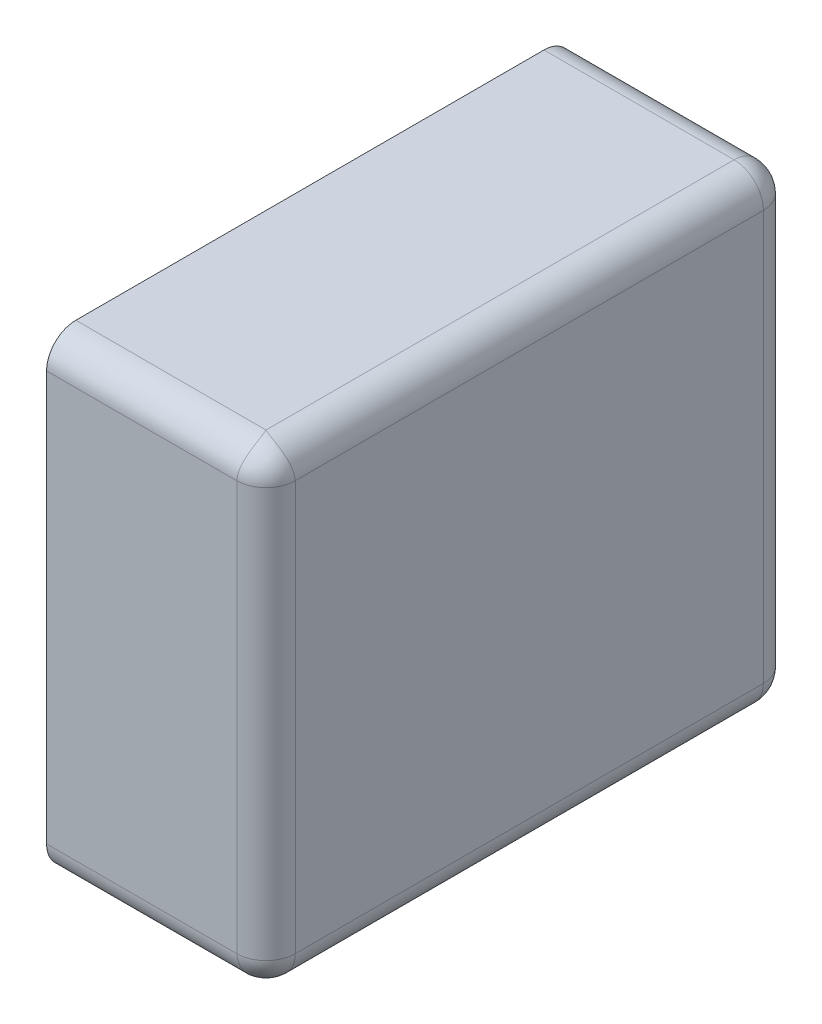
ISO-10303-21;
HEADER;
FILE_DESCRIPTION(('STEP AP214'),'2;1');
FILE_NAME('part.step','',(''),(''),'','','');
FILE_SCHEMA(('AUTOMOTIVE_DESIGN { 1 0 10303 214 1 1 1 1 }'));
ENDSEC;
DATA;
#1=APPLICATION_CONTEXT('core data for automotive mechanical design processes');
#2=APPLICATION_PROTOCOL_DEFINITION('international standard','automotive_design',2000,#1);
#3=PRODUCT_CONTEXT('',#1,'mechanical');
#4=PRODUCT('Part','Part','',(#3));
#5=PRODUCT_RELATED_PRODUCT_CATEGORY('part','',(#4));
#6=PRODUCT_DEFINITION_FORMATION('','',#4);
#7=PRODUCT_DEFINITION_CONTEXT('part definition',#1,'design');
#8=PRODUCT_DEFINITION('design','',#6,#7);
#9=PRODUCT_DEFINITION_SHAPE('','',#8);
#10=(LENGTH_UNIT() NAMED_UNIT(*) SI_UNIT(.MILLI.,.METRE.));
#11=(NAMED_UNIT(*) PLANE_ANGLE_UNIT() SI_UNIT($,.RADIAN.));
#12=(NAMED_UNIT(*) SI_UNIT($,.STERADIAN.) SOLID_ANGLE_UNIT());
#13=UNCERTAINTY_MEASURE_WITH_UNIT(LENGTH_MEASURE(1.E-05),#10,'distance_accuracy_value','');
#14=(GEOMETRIC_REPRESENTATION_CONTEXT(3) GLOBAL_UNCERTAINTY_ASSIGNED_CONTEXT((#13)) GLOBAL_UNIT_ASSIGNED_CONTEXT((#10,
#11,#12)) REPRESENTATION_CONTEXT('',''));
#15=CARTESIAN_POINT('',(0.,0.,0.));
#16=DIRECTION('',(0.,0.,1.));
#17=DIRECTION('',(1.,0.,0.));
#18=AXIS2_PLACEMENT_3D('',#15,#16,#17);
#19=CARTESIAN_POINT('',(0.75,-0.35,0.85));
#20=DIRECTION('',(-0.408248290463863,-0.816496580927726,-0.408248290463863));
#21=DIRECTION('',(0.577350269189626,-0.577350269189626,0.577350269189626));
#22=AXIS2_PLACEMENT_3D('',#19,#20,#21);
#23=SPHERICAL_SURFACE('',#22,0.05);
#24=CARTESIAN_POINT('',(0.75,-0.35,0.9));
#25=CARTESIAN_POINT('',(0.750056476640882,-0.350831352427667,0.900000020313967));
#26=CARTESIAN_POINT('',(0.750121168311557,-0.351662111124828,0.899979171317549));
#27=CARTESIAN_POINT('',(0.750265391195623,-0.353324024248752,0.899895695565037));
#28=CARTESIAN_POINT('',(0.750344988001439,-0.354155163571538,0.899832880868058));
#29=CARTESIAN_POINT('',(0.750517234671643,-0.355815236106077,0.899665097579262));
#30=CARTESIAN_POINT('',(0.750609936033336,-0.356644146794953,0.899559959502557));
#31=CARTESIAN_POINT('',(0.750806520816707,-0.358297216645363,0.899307372398355));
#32=CARTESIAN_POINT('',(0.75091044290025,-0.359121348357221,0.899159773963409));
#33=CARTESIAN_POINT('',(0.751127528752862,-0.360762347249152,0.898822292392348));
#34=CARTESIAN_POINT('',(0.751240719867609,-0.361579184426825,0.898632281058567));
#35=CARTESIAN_POINT('',(0.751474344176626,-0.363203132016743,0.898210195281024));
#36=CARTESIAN_POINT('',(0.751594795122853,-0.364010212271137,0.897978014684369));
#37=CARTESIAN_POINT('',(0.751840892195576,-0.365612241167447,0.897472005262752));
#38=CARTESIAN_POINT('',(0.751966548375925,-0.36640716184318,0.897198092814035));
#39=CARTESIAN_POINT('',(0.752220973549075,-0.367982533533888,0.896609228401466));
#40=CARTESIAN_POINT('',(0.752349746928956,-0.36876296105217,0.89629421548598));
#41=CARTESIAN_POINT('',(0.752608300810853,-0.370307083417801,0.89562395131688));
#42=CARTESIAN_POINT('',(0.752738082163723,-0.371070761417873,0.895268661584212));
#43=CARTESIAN_POINT('',(0.752996535248399,-0.372579204861783,0.894518835357465));
#44=CARTESIAN_POINT('',(0.753125206487437,-0.373323962166104,0.894124282319878));
#45=CARTESIAN_POINT('',(0.753379323912972,-0.374792475072041,0.893297108379355));
#46=CARTESIAN_POINT('',(0.753504770480528,-0.37551623315645,0.892864492001337));
#47=CARTESIAN_POINT('',(0.753750336828149,-0.376940756399464,0.891962553597264));
#48=CARTESIAN_POINT('',(0.753870460068205,-0.377641536413672,0.891493255977843));
#49=CARTESIAN_POINT('',(0.754103304064891,-0.379018216920503,0.890519495705679));
#50=CARTESIAN_POINT('',(0.754216033516177,-0.379694146209385,0.890015075848481));
#51=CARTESIAN_POINT('',(0.754432052512975,-0.381019349498018,0.888972784289588));
#52=CARTESIAN_POINT('',(0.754535358057478,-0.381668667602786,0.888434971990044));
#53=CARTESIAN_POINT('',(0.754730542154479,-0.382938989255036,0.887327774609329));
#54=CARTESIAN_POINT('',(0.754822445957708,-0.383560053368979,0.886758463484926));
#55=CARTESIAN_POINT('',(0.754992901649071,-0.384772329390201,0.885590305843476));
#56=CARTESIAN_POINT('',(0.755071489829275,-0.3853636192483,0.88499154553938));
#57=CARTESIAN_POINT('',(0.755213463043959,-0.386514935275151,0.883766676890247));
#58=CARTESIAN_POINT('',(0.755276897009026,-0.387075057459189,0.883140664496341));
#59=CARTESIAN_POINT('',(0.755386795425954,-0.388162756781776,0.881863619839021));
#60=CARTESIAN_POINT('',(0.755433322818258,-0.388690448425676,0.881212690558093));
#61=CARTESIAN_POINT('',(0.755507737338679,-0.389712138796154,0.879888271236327));
#62=CARTESIAN_POINT('',(0.75553570253075,-0.390206270678963,0.879214888348585));
#63=CARTESIAN_POINT('',(0.755571427793508,-0.391159829885339,0.877848141278855));
#64=CARTESIAN_POINT('',(0.755579281877824,-0.391619408903357,0.877154885445235));
#65=CARTESIAN_POINT('',(0.755573335713261,-0.392502989090476,0.875751081087255));
#66=CARTESIAN_POINT('',(0.755559645939104,-0.392927160099263,0.875040639060477));
#67=CARTESIAN_POINT('',(0.755509287643763,-0.393739190835606,0.873605248184243));
#68=CARTESIAN_POINT('',(0.755472746231199,-0.394127237870004,0.872880400913832));
#69=CARTESIAN_POINT('',(0.755375493621831,-0.394866427926017,0.871419070457526));
#70=CARTESIAN_POINT('',(0.755314925981526,-0.395217774756478,0.870682680895238));
#71=CARTESIAN_POINT('',(0.755168570932992,-0.395883112710797,0.869201208347948));
#72=CARTESIAN_POINT('',(0.755082942970717,-0.396197322893436,0.868456208087868));
#73=CARTESIAN_POINT('',(0.754885566112575,-0.396788076154931,0.866960517038454));
#74=CARTESIAN_POINT('',(0.754773991607376,-0.397064852010877,0.866209895271862));
#75=CARTESIAN_POINT('',(0.754523973299393,-0.397580565826942,0.864706002926951));
#76=CARTESIAN_POINT('',(0.754385717519098,-0.39781974846915,0.863952785138196));
#77=CARTESIAN_POINT('',(0.754081755398417,-0.398260239191747,0.862446796385434));
#78=CARTESIAN_POINT('',(0.753916248962334,-0.398461801820209,0.861694059537444));
#79=CARTESIAN_POINT('',(0.75355734372636,-0.398827165694317,0.860192060427522));
#80=CARTESIAN_POINT('',(0.753364154831346,-0.398991228948502,0.859442812292273));
#81=CARTESIAN_POINT('',(0.753052732369609,-0.39920955873537,0.858321945507501));
#82=CARTESIAN_POINT('',(0.752945638881777,-0.399277560154943,0.857949832604319));
#83=CARTESIAN_POINT('',(0.752724431166697,-0.3994042588909,0.857207637428366));
#84=CARTESIAN_POINT('',(0.752610344441124,-0.399462989767779,0.856837552741953));
#85=CARTESIAN_POINT('',(0.752375149481327,-0.399571193360768,0.856099812695661));
#86=CARTESIAN_POINT('',(0.752254068989278,-0.399620699753114,0.855732153421865));
#87=CARTESIAN_POINT('',(0.752004892004011,-0.399710512986096,0.854999641822439));
#88=CARTESIAN_POINT('',(0.751876823418455,-0.399750853511815,0.854634784141683));
#89=CARTESIAN_POINT('',(0.75161368768569,-0.399822399896224,0.853908256305697));
#90=CARTESIAN_POINT('',(0.751478648512781,-0.399853639363523,0.853546579332125));
#91=CARTESIAN_POINT('',(0.751201599789781,-0.399907056499251,0.85282678964261));
#92=CARTESIAN_POINT('',(0.751059618183824,-0.39992926760641,0.852468668656838));
#93=CARTESIAN_POINT('',(0.750768722771826,-0.39996470752091,0.851756364451594));
#94=CARTESIAN_POINT('',(0.750619836783965,-0.399977969507428,0.851402171529021));
#95=CARTESIAN_POINT('',(0.750315184973883,-0.399995600075518,0.850698095332166));
#96=CARTESIAN_POINT('',(0.75015944673132,-0.400000001475902,0.850348200942932));
#97=CARTESIAN_POINT('',(0.75,-0.4,0.85));
#98=B_SPLINE_CURVE_WITH_KNOTS('',3,(#24,#25,#26,#27,#28,#29,#30,#31,#32,#33,#34,#35,#36,#37,#38,
#39,#40,#41,#42,#43,#44,#45,#46,#47,#48,#49,#50,#51,#52,#53,#54,#55,#56,#57,#58,#59,#60,#61,#62,
#63,#64,#65,#66,#67,#68,#69,#70,#71,#72,#73,#74,#75,#76,#77,#78,#79,#80,#81,#82,#83,#84,#85,#86,
#87,#88,#89,#90,#91,#92,#93,#94,#95,#96,#97),.UNSPECIFIED.,.F.,.F.,(4,2,2,2,2,2,2,2,2,2,2,2,2,2,
2,2,2,2,2,2,2,2,2,2,2,2,2,2,2,2,2,2,2,2,2,2,4),(0.,0.00249945349828853,0.00501017636236168,
0.00753105510997412,0.0100609150362242,0.0125985278601288,0.015142619470862,0.017691877752768,
0.020244960471291,0.0228005032044076,0.025357127306039,0.0279134478892867,0.0304680818182009,
0.0330196556971653,0.0355668138468767,0.0381082262553104,0.0406425964909795,0.0431686695642027,
0.0456852397199664,0.048191158143267,0.0506853405545278,0.0531667746687542,0.0556345274875087,
0.0580877523875283,0.0605256959638784,0.0629477045789642,0.0653532305615732,0.0677418379925142,
0.0701132080055175,0.0712924926926684,0.0724674051483095,0.0736379404537151,0.0748041017706803,
0.0759659004268234,0.077123355986903,0.078276496309334,0.0794253575870823),.UNSPECIFIED.);
#99=CARTESIAN_POINT('',(0.75,-0.35,0.9));
#100=VERTEX_POINT('',#99);
#101=CARTESIAN_POINT('',(0.75,-0.4,0.85));
#102=VERTEX_POINT('',#101);
#103=EDGE_CURVE('E11',#100,#102,#98,.T.);
#104=ORIENTED_EDGE('',*,*,#103,.T.);
#105=CARTESIAN_POINT('',(0.75,-0.35,0.85));
#106=DIRECTION('',(0.,0.,1.));
#107=DIRECTION('',(1.,0.,0.));
#108=AXIS2_PLACEMENT_3D('',#105,#106,#107);
#109=CIRCLE('',#108,0.05);
#110=CARTESIAN_POINT('',(0.8,-0.35,0.85));
#111=VERTEX_POINT('',#110);
#112=EDGE_CURVE('E25',#102,#111,#109,.T.);
#113=ORIENTED_EDGE('',*,*,#112,.T.);
#114=CARTESIAN_POINT('',(0.75,-0.35,0.85));
#115=DIRECTION('',(0.,-1.,0.));
#116=DIRECTION('',(0.,0.,1.));
#117=AXIS2_PLACEMENT_3D('',#114,#115,#116);
#118=CIRCLE('',#117,0.05);
#119=EDGE_CURVE('E272',#111,#100,#118,.T.);
#120=ORIENTED_EDGE('',*,*,#119,.T.);
#121=EDGE_LOOP('',(#104,#113,#120));
#122=FACE_BOUND('',#121,.T.);
#123=ADVANCED_FACE('F17',(#122),#23,.T.);
#124=CARTESIAN_POINT('',(0.75,-0.35,0.05));
#125=DIRECTION('',(-0.816496580927726,-0.408248290463864,-0.408248290463863));
#126=DIRECTION('',(0.577350269189626,-0.577350269189626,-0.577350269189626));
#127=AXIS2_PLACEMENT_3D('',#124,#125,#126);
#128=SPHERICAL_SURFACE('',#127,0.05);
#129=CARTESIAN_POINT('',(0.75,-0.35,0.05));
#130=DIRECTION('',(1.,0.,0.));
#131=DIRECTION('',(0.,0.,-1.));
#132=AXIS2_PLACEMENT_3D('',#129,#130,#131);
#133=CIRCLE('',#132,0.05);
#134=CARTESIAN_POINT('',(0.75,-0.4,0.05));
#135=VERTEX_POINT('',#134);
#136=CARTESIAN_POINT('',(0.75,-0.35,0.));
#137=VERTEX_POINT('',#136);
#138=EDGE_CURVE('E266',#135,#137,#133,.T.);
#139=ORIENTED_EDGE('',*,*,#138,.T.);
#140=CARTESIAN_POINT('',(0.75,-0.35,0.05));
#141=DIRECTION('',(0.,-1.,0.));
#142=DIRECTION('',(1.,0.,0.));
#143=AXIS2_PLACEMENT_3D('',#140,#141,#142);
#144=CIRCLE('',#143,0.05);
#145=CARTESIAN_POINT('',(0.8,-0.35,0.05));
#146=VERTEX_POINT('',#145);
#147=EDGE_CURVE('E268',#137,#146,#144,.T.);
#148=ORIENTED_EDGE('',*,*,#147,.T.);
#149=CARTESIAN_POINT('',(0.75,-0.35,0.05));
#150=DIRECTION('',(0.,0.,-1.));
#151=DIRECTION('',(0.,-1.,0.));
#152=AXIS2_PLACEMENT_3D('',#149,#150,#151);
#153=CIRCLE('',#152,0.05);
#154=EDGE_CURVE('E270',#146,#135,#153,.T.);
#155=ORIENTED_EDGE('',*,*,#154,.T.);
#156=EDGE_LOOP('',(#139,#148,#155));
#157=FACE_BOUND('',#156,.T.);
#158=ADVANCED_FACE('F249',(#157),#128,.T.);
#159=CARTESIAN_POINT('',(0.75,0.35,0.85));
#160=DIRECTION('',(0.408248290463863,-0.816496580927726,0.408248290463863));
#161=DIRECTION('',(0.577350269189626,0.577350269189626,0.577350269189626));
#162=AXIS2_PLACEMENT_3D('',#159,#160,#161);
#163=SPHERICAL_SURFACE('',#162,0.05);
#164=CARTESIAN_POINT('',(0.75,0.35,0.85));
#165=DIRECTION('',(0.,1.,0.));
#166=DIRECTION('',(1.,0.,0.));
#167=AXIS2_PLACEMENT_3D('',#164,#165,#166);
#168=CIRCLE('',#167,0.05);
#169=CARTESIAN_POINT('',(0.75,0.35,0.9));
#170=VERTEX_POINT('',#169);
#171=CARTESIAN_POINT('',(0.8,0.35,0.85));
#172=VERTEX_POINT('',#171);
#173=EDGE_CURVE('E300',#170,#172,#168,.T.);
#174=ORIENTED_EDGE('',*,*,#173,.T.);
#175=CARTESIAN_POINT('',(0.8,0.35,0.85));
#176=CARTESIAN_POINT('',(0.800000020313967,0.350831352427667,0.850056476640882));
#177=CARTESIAN_POINT('',(0.799979171317549,0.351662111124828,0.850121168311557));
#178=CARTESIAN_POINT('',(0.799895695565037,0.353324024248752,0.850265391195623));
#179=CARTESIAN_POINT('',(0.799832880868058,0.354155163571538,0.850344988001439));
#180=CARTESIAN_POINT('',(0.799665097579262,0.355815236106077,0.850517234671643));
#181=CARTESIAN_POINT('',(0.799559959502558,0.356644146794953,0.850609936033336));
#182=CARTESIAN_POINT('',(0.799307372398355,0.358297216645363,0.850806520816706));
#183=CARTESIAN_POINT('',(0.799159773963409,0.359121348357221,0.85091044290025));
#184=CARTESIAN_POINT('',(0.798822292392348,0.360762347249152,0.851127528752862));
#185=CARTESIAN_POINT('',(0.798632281058567,0.361579184426825,0.851240719867609));
#186=CARTESIAN_POINT('',(0.798210195281024,0.363203132016743,0.851474344176626));
#187=CARTESIAN_POINT('',(0.797978014684369,0.364010212271137,0.851594795122853));
#188=CARTESIAN_POINT('',(0.797472005262752,0.365612241167447,0.851840892195576));
#189=CARTESIAN_POINT('',(0.797198092814036,0.36640716184318,0.851966548375925));
#190=CARTESIAN_POINT('',(0.796609228401466,0.367982533533888,0.852220973549075));
#191=CARTESIAN_POINT('',(0.79629421548598,0.36876296105217,0.852349746928956));
#192=CARTESIAN_POINT('',(0.79562395131688,0.370307083417801,0.852608300810853));
#193=CARTESIAN_POINT('',(0.795268661584212,0.371070761417873,0.852738082163722));
#194=CARTESIAN_POINT('',(0.794518835357465,0.372579204861783,0.852996535248399));
#195=CARTESIAN_POINT('',(0.794124282319878,0.373323962166104,0.853125206487437));
#196=CARTESIAN_POINT('',(0.793297108379355,0.374792475072041,0.853379323912972));
#197=CARTESIAN_POINT('',(0.792864492001337,0.37551623315645,0.853504770480528));
#198=CARTESIAN_POINT('',(0.791962553597264,0.376940756399464,0.853750336828149));
#199=CARTESIAN_POINT('',(0.791493255977843,0.377641536413672,0.853870460068205));
#200=CARTESIAN_POINT('',(0.790519495705679,0.379018216920503,0.854103304064891));
#201=CARTESIAN_POINT('',(0.790015075848481,0.379694146209385,0.854216033516177));
#202=CARTESIAN_POINT('',(0.788972784289588,0.381019349498018,0.854432052512975));
#203=CARTESIAN_POINT('',(0.788434971990044,0.381668667602786,0.854535358057478));
#204=CARTESIAN_POINT('',(0.787327774609329,0.382938989255036,0.854730542154479));
#205=CARTESIAN_POINT('',(0.786758463484927,0.383560053368979,0.854822445957708));
#206=CARTESIAN_POINT('',(0.785590305843476,0.384772329390201,0.854992901649071));
#207=CARTESIAN_POINT('',(0.78499154553938,0.3853636192483,0.855071489829275));
#208=CARTESIAN_POINT('',(0.783766676890247,0.386514935275151,0.855213463043959));
#209=CARTESIAN_POINT('',(0.783140664496341,0.387075057459189,0.855276897009026));
#210=CARTESIAN_POINT('',(0.781863619839021,0.388162756781776,0.855386795425953));
#211=CARTESIAN_POINT('',(0.781212690558093,0.388690448425676,0.855433322818258));
#212=CARTESIAN_POINT('',(0.779888271236327,0.389712138796154,0.855507737338678));
#213=CARTESIAN_POINT('',(0.779214888348585,0.390206270678963,0.85553570253075));
#214=CARTESIAN_POINT('',(0.777848141278855,0.391159829885339,0.855571427793508));
#215=CARTESIAN_POINT('',(0.777154885445235,0.391619408903357,0.855579281877824));
#216=CARTESIAN_POINT('',(0.775751081087255,0.392502989090476,0.855573335713261));
#217=CARTESIAN_POINT('',(0.775040639060477,0.392927160099263,0.855559645939104));
#218=CARTESIAN_POINT('',(0.773605248184243,0.393739190835606,0.855509287643763));
#219=CARTESIAN_POINT('',(0.772880400913832,0.394127237870004,0.855472746231199));
#220=CARTESIAN_POINT('',(0.771419070457526,0.394866427926017,0.855375493621831));
#221=CARTESIAN_POINT('',(0.770682680895238,0.395217774756478,0.855314925981525));
#222=CARTESIAN_POINT('',(0.769201208347948,0.395883112710797,0.855168570932992));
#223=CARTESIAN_POINT('',(0.768456208087868,0.396197322893436,0.855082942970717));
#224=CARTESIAN_POINT('',(0.766960517038454,0.396788076154931,0.854885566112575));
#225=CARTESIAN_POINT('',(0.766209895271862,0.397064852010877,0.854773991607376));
#226=CARTESIAN_POINT('',(0.764706002926951,0.397580565826942,0.854523973299393));
#227=CARTESIAN_POINT('',(0.763952785138196,0.39781974846915,0.854385717519098));
#228=CARTESIAN_POINT('',(0.762446796385434,0.398260239191747,0.854081755398417));
#229=CARTESIAN_POINT('',(0.761694059537445,0.398461801820209,0.853916248962334));
#230=CARTESIAN_POINT('',(0.760192060427522,0.398827165694317,0.853557343726359));
#231=CARTESIAN_POINT('',(0.759442812292273,0.398991228948502,0.853364154831346));
#232=CARTESIAN_POINT('',(0.758321945507501,0.39920955873537,0.853052732369609));
#233=CARTESIAN_POINT('',(0.757949832604319,0.399277560154943,0.852945638881777));
#234=CARTESIAN_POINT('',(0.757207637428366,0.3994042588909,0.852724431166697));
#235=CARTESIAN_POINT('',(0.756837552741953,0.399462989767779,0.852610344441124));
#236=CARTESIAN_POINT('',(0.756099812695661,0.399571193360768,0.852375149481327));
#237=CARTESIAN_POINT('',(0.755732153421865,0.399620699753114,0.852254068989278));
#238=CARTESIAN_POINT('',(0.754999641822439,0.399710512986096,0.852004892004011));
#239=CARTESIAN_POINT('',(0.754634784141684,0.399750853511815,0.851876823418455));
#240=CARTESIAN_POINT('',(0.753908256305697,0.399822399896224,0.85161368768569));
#241=CARTESIAN_POINT('',(0.753546579332125,0.399853639363523,0.851478648512781));
#242=CARTESIAN_POINT('',(0.75282678964261,0.399907056499251,0.851201599789781));
#243=CARTESIAN_POINT('',(0.752468668656838,0.39992926760641,0.851059618183824));
#244=CARTESIAN_POINT('',(0.751756364451594,0.39996470752091,0.850768722771826));
#245=CARTESIAN_POINT('',(0.751402171529021,0.399977969507428,0.850619836783965));
#246=CARTESIAN_POINT('',(0.750698095332166,0.399995600075518,0.850315184973883));
#247=CARTESIAN_POINT('',(0.750348200942932,0.400000001475902,0.85015944673132));
#248=CARTESIAN_POINT('',(0.75,0.4,0.85));
#249=B_SPLINE_CURVE_WITH_KNOTS('',3,(#175,#176,#177,#178,#179,#180,#181,#182,#183,#184,#185,
#186,#187,#188,#189,#190,#191,#192,#193,#194,#195,#196,#197,#198,#199,#200,#201,#202,#203,#204,
#205,#206,#207,#208,#209,#210,#211,#212,#213,#214,#215,#216,#217,#218,#219,#220,#221,#222,#223,
#224,#225,#226,#227,#228,#229,#230,#231,#232,#233,#234,#235,#236,#237,#238,#239,#240,#241,#242,
#243,#244,#245,#246,#247,#248),.UNSPECIFIED.,.F.,.F.,(4,2,2,2,2,2,2,2,2,2,2,2,2,2,2,2,2,2,2,2,2,
2,2,2,2,2,2,2,2,2,2,2,2,2,2,2,4),(0.,0.00249945349828853,0.00501017636236168,
0.00753105510997411,0.0100609150362242,0.0125985278601288,0.015142619470862,0.0176918777527679,
0.0202449604712909,0.0228005032044076,0.025357127306039,0.0279134478892866,0.0304680818182009,
0.0330196556971653,0.0355668138468768,0.0381082262553104,0.0406425964909795,0.0431686695642027,
0.0456852397199663,0.048191158143267,0.0506853405545278,0.0531667746687543,0.0556345274875087,
0.0580877523875283,0.0605256959638785,0.0629477045789642,0.0653532305615732,0.0677418379925142,
0.0701132080055176,0.0712924926926684,0.0724674051483096,0.0736379404537152,0.0748041017706802,
0.0759659004268234,0.077123355986903,0.0782764963093341,0.0794253575870823),.UNSPECIFIED.);
#250=CARTESIAN_POINT('',(0.75,0.4,0.85));
#251=VERTEX_POINT('',#250);
#252=EDGE_CURVE('E232',#172,#251,#249,.T.);
#253=ORIENTED_EDGE('',*,*,#252,.T.);
#254=CARTESIAN_POINT('',(0.75,0.4,0.85));
#255=CARTESIAN_POINT('',(0.750159446731321,0.400000001475902,0.850348200942932));
#256=CARTESIAN_POINT('',(0.750315184973883,0.399995600075518,0.850698095332166));
#257=CARTESIAN_POINT('',(0.750619836783965,0.399977969507428,0.851402171529021));
#258=CARTESIAN_POINT('',(0.750768722771826,0.39996470752091,0.851756364451594));
#259=CARTESIAN_POINT('',(0.751059618183824,0.39992926760641,0.852468668656838));
#260=CARTESIAN_POINT('',(0.751201599789781,0.399907056499251,0.85282678964261));
#261=CARTESIAN_POINT('',(0.751478648512781,0.399853639363523,0.853546579332125));
#262=CARTESIAN_POINT('',(0.75161368768569,0.399822399896224,0.853908256305697));
#263=CARTESIAN_POINT('',(0.751876823418455,0.399750853511815,0.854634784141683));
#264=CARTESIAN_POINT('',(0.752004892004011,0.399710512986096,0.854999641822439));
#265=CARTESIAN_POINT('',(0.752254068989278,0.399620699753114,0.855732153421864));
#266=CARTESIAN_POINT('',(0.752375149481327,0.399571193360768,0.856099812695661));
#267=CARTESIAN_POINT('',(0.752610344441124,0.399462989767779,0.856837552741953));
#268=CARTESIAN_POINT('',(0.752724431166697,0.3994042588909,0.857207637428366));
#269=CARTESIAN_POINT('',(0.752945638881777,0.399277560154943,0.857949832604319));
#270=CARTESIAN_POINT('',(0.753052732369609,0.39920955873537,0.858321945507501));
#271=CARTESIAN_POINT('',(0.753364154831346,0.398991228948502,0.859442812292273));
#272=CARTESIAN_POINT('',(0.75355734372636,0.398827165694317,0.860192060427522));
#273=CARTESIAN_POINT('',(0.753916248962334,0.398461801820209,0.861694059537444));
#274=CARTESIAN_POINT('',(0.754081755398417,0.398260239191747,0.862446796385434));
#275=CARTESIAN_POINT('',(0.754385717519098,0.39781974846915,0.863952785138196));
#276=CARTESIAN_POINT('',(0.754523973299393,0.397580565826942,0.864706002926951));
#277=CARTESIAN_POINT('',(0.754773991607376,0.397064852010877,0.866209895271862));
#278=CARTESIAN_POINT('',(0.754885566112575,0.396788076154931,0.866960517038454));
#279=CARTESIAN_POINT('',(0.755082942970717,0.396197322893436,0.868456208087868));
#280=CARTESIAN_POINT('',(0.755168570932992,0.395883112710797,0.869201208347948));
#281=CARTESIAN_POINT('',(0.755314925981526,0.395217774756478,0.870682680895238));
#282=CARTESIAN_POINT('',(0.755375493621831,0.394866427926017,0.871419070457526));
#283=CARTESIAN_POINT('',(0.755472746231199,0.394127237870004,0.872880400913832));
#284=CARTESIAN_POINT('',(0.755509287643763,0.393739190835606,0.873605248184243));
#285=CARTESIAN_POINT('',(0.755559645939104,0.392927160099263,0.875040639060477));
#286=CARTESIAN_POINT('',(0.755573335713261,0.392502989090476,0.875751081087255));
#287=CARTESIAN_POINT('',(0.755579281877824,0.391619408903357,0.877154885445235));
#288=CARTESIAN_POINT('',(0.755571427793508,0.391159829885339,0.877848141278855));
#289=CARTESIAN_POINT('',(0.75553570253075,0.390206270678963,0.879214888348585));
#290=CARTESIAN_POINT('',(0.755507737338678,0.389712138796154,0.879888271236327));
#291=CARTESIAN_POINT('',(0.755433322818258,0.388690448425676,0.881212690558093));
#292=CARTESIAN_POINT('',(0.755386795425953,0.388162756781776,0.881863619839021));
#293=CARTESIAN_POINT('',(0.755276897009026,0.387075057459189,0.883140664496341));
#294=CARTESIAN_POINT('',(0.755213463043959,0.386514935275151,0.883766676890247));
#295=CARTESIAN_POINT('',(0.755071489829275,0.3853636192483,0.88499154553938));
#296=CARTESIAN_POINT('',(0.754992901649071,0.384772329390201,0.885590305843476));
#297=CARTESIAN_POINT('',(0.754822445957708,0.383560053368979,0.886758463484926));
#298=CARTESIAN_POINT('',(0.754730542154479,0.382938989255036,0.887327774609329));
#299=CARTESIAN_POINT('',(0.754535358057478,0.381668667602786,0.888434971990044));
#300=CARTESIAN_POINT('',(0.754432052512975,0.381019349498018,0.888972784289588));
#301=CARTESIAN_POINT('',(0.754216033516177,0.379694146209385,0.890015075848481));
#302=CARTESIAN_POINT('',(0.754103304064891,0.379018216920503,0.890519495705679));
#303=CARTESIAN_POINT('',(0.753870460068205,0.377641536413672,0.891493255977843));
#304=CARTESIAN_POINT('',(0.753750336828149,0.376940756399464,0.891962553597264));
#305=CARTESIAN_POINT('',(0.753504770480528,0.37551623315645,0.892864492001337));
#306=CARTESIAN_POINT('',(0.753379323912972,0.374792475072041,0.893297108379355));
#307=CARTESIAN_POINT('',(0.753125206487437,0.373323962166104,0.894124282319878));
#308=CARTESIAN_POINT('',(0.752996535248399,0.372579204861783,0.894518835357465));
#309=CARTESIAN_POINT('',(0.752738082163722,0.371070761417873,0.895268661584212));
#310=CARTESIAN_POINT('',(0.752608300810853,0.370307083417801,0.89562395131688));
#311=CARTESIAN_POINT('',(0.752349746928956,0.36876296105217,0.89629421548598));
#312=CARTESIAN_POINT('',(0.752220973549075,0.367982533533888,0.896609228401466));
#313=CARTESIAN_POINT('',(0.751966548375925,0.36640716184318,0.897198092814035));
#314=CARTESIAN_POINT('',(0.751840892195576,0.365612241167447,0.897472005262752));
#315=CARTESIAN_POINT('',(0.751594795122853,0.364010212271137,0.897978014684369));
#316=CARTESIAN_POINT('',(0.751474344176626,0.363203132016743,0.898210195281024));
#317=CARTESIAN_POINT('',(0.751240719867609,0.361579184426825,0.898632281058567));
#318=CARTESIAN_POINT('',(0.751127528752862,0.360762347249152,0.898822292392348));
#319=CARTESIAN_POINT('',(0.75091044290025,0.359121348357221,0.899159773963409));
#320=CARTESIAN_POINT('',(0.750806520816706,0.358297216645363,0.899307372398355));
#321=CARTESIAN_POINT('',(0.750609936033336,0.356644146794953,0.899559959502557));
#322=CARTESIAN_POINT('',(0.750517234671643,0.355815236106077,0.899665097579262));
#323=CARTESIAN_POINT('',(0.750344988001439,0.354155163571538,0.899832880868058));
#324=CARTESIAN_POINT('',(0.750265391195623,0.353324024248752,0.899895695565037));
#325=CARTESIAN_POINT('',(0.750121168311557,0.351662111124828,0.899979171317549));
#326=CARTESIAN_POINT('',(0.750056476640882,0.350831352427667,0.900000020313967));
#327=CARTESIAN_POINT('',(0.75,0.35,0.9));
#328=B_SPLINE_CURVE_WITH_KNOTS('',3,(#254,#255,#256,#257,#258,#259,#260,#261,#262,#263,#264,
#265,#266,#267,#268,#269,#270,#271,#272,#273,#274,#275,#276,#277,#278,#279,#280,#281,#282,#283,
#284,#285,#286,#287,#288,#289,#290,#291,#292,#293,#294,#295,#296,#297,#298,#299,#300,#301,#302,
#303,#304,#305,#306,#307,#308,#309,#310,#311,#312,#313,#314,#315,#316,#317,#318,#319,#320,#321,
#322,#323,#324,#325,#326,#327),.UNSPECIFIED.,.F.,.F.,(4,2,2,2,2,2,2,2,2,2,2,2,2,2,2,2,2,2,2,2,2,
2,2,2,2,2,2,2,2,2,2,2,2,2,2,2,4),(0.,0.00114886127774814,0.00230200160017927,
0.00345945716025885,0.00462125581640191,0.00578741713336712,0.00695795243877274,
0.00813286489441386,0.00931214958156475,0.0116835195945681,0.0140721270255091,
0.0164776530081181,0.0188996616232038,0.021337605199554,0.0237908300995736,0.026258582918328,
0.0287400170325545,0.0312341994438153,0.0337401178671159,0.0362566880228795,0.0387827610961028,
0.0413171313317718,0.0438585437402055,0.046405701889917,0.0489572757688814,0.0515119096977956,
0.0540682302810433,0.0566248543826747,0.0591803971157913,0.0617334798343143,0.0642827381162203,
0.0668268297269535,0.0693644425508581,0.0718943024771082,0.0744151812247206,0.0769259040887937,
0.0794253575870823),.UNSPECIFIED.);
#329=EDGE_CURVE('E192',#251,#170,#328,.T.);
#330=ORIENTED_EDGE('',*,*,#329,.T.);
#331=EDGE_LOOP('',(#174,#253,#330));
#332=FACE_BOUND('',#331,.T.);
#333=ADVANCED_FACE('F239',(#332),#163,.T.);
#334=CARTESIAN_POINT('',(0.75,0.35,0.05));
#335=DIRECTION('',(-0.816496580927726,0.408248290463864,-0.408248290463863));
#336=DIRECTION('',(0.577350269189626,0.577350269189626,-0.577350269189625));
#337=AXIS2_PLACEMENT_3D('',#334,#335,#336);
#338=SPHERICAL_SURFACE('',#337,0.05);
#339=CARTESIAN_POINT('',(0.75,0.35,0.05));
#340=DIRECTION('',(0.,0.,-1.));
#341=DIRECTION('',(1.,0.,0.));
#342=AXIS2_PLACEMENT_3D('',#339,#340,#341);
#343=CIRCLE('',#342,0.05);
#344=CARTESIAN_POINT('',(0.75,0.4,0.05));
#345=VERTEX_POINT('',#344);
#346=CARTESIAN_POINT('',(0.8,0.35,0.05));
#347=VERTEX_POINT('',#346);
#348=EDGE_CURVE('E190',#345,#347,#343,.T.);
#349=ORIENTED_EDGE('',*,*,#348,.T.);
#350=CARTESIAN_POINT('',(0.75,0.35,0.05));
#351=DIRECTION('',(0.,1.,0.));
#352=DIRECTION('',(0.,0.,-1.));
#353=AXIS2_PLACEMENT_3D('',#350,#351,#352);
#354=CIRCLE('',#353,0.05);
#355=CARTESIAN_POINT('',(0.75,0.35,0.));
#356=VERTEX_POINT('',#355);
#357=EDGE_CURVE('E188',#347,#356,#354,.T.);
#358=ORIENTED_EDGE('',*,*,#357,.T.);
#359=CARTESIAN_POINT('',(0.75,0.35,0.05));
#360=DIRECTION('',(1.,0.,0.));
#361=DIRECTION('',(0.,1.,0.));
#362=AXIS2_PLACEMENT_3D('',#359,#360,#361);
#363=CIRCLE('',#362,0.05);
#364=EDGE_CURVE('E185',#356,#345,#363,.T.);
#365=ORIENTED_EDGE('',*,*,#364,.T.);
#366=EDGE_LOOP('',(#349,#358,#365));
#367=FACE_BOUND('',#366,.T.);
#368=ADVANCED_FACE('F248',(#367),#338,.T.);
#369=CARTESIAN_POINT('',(0.75,-0.2,0.05));
#370=DIRECTION('',(0.,1.,0.));
#371=DIRECTION('',(0.707106781186548,0.,-0.707106781186547));
#372=AXIS2_PLACEMENT_3D('',#369,#370,#371);
#373=CYLINDRICAL_SURFACE('',#372,0.05);
#374=ORIENTED_EDGE('',*,*,#357,.F.);
#375=DIRECTION('',(0.,-1.,0.));
#376=VECTOR('',#375,1.);
#377=CARTESIAN_POINT('',(0.8,-0.2,0.05));
#378=LINE('',#377,#376);
#379=EDGE_CURVE('E182',#347,#146,#378,.T.);
#380=ORIENTED_EDGE('',*,*,#379,.T.);
#381=ORIENTED_EDGE('',*,*,#147,.F.);
#382=DIRECTION('',(0.,1.,0.));
#383=VECTOR('',#382,1.);
#384=CARTESIAN_POINT('',(0.75,-0.2,0.));
#385=LINE('',#384,#383);
#386=EDGE_CURVE('E179',#137,#356,#385,.T.);
#387=ORIENTED_EDGE('',*,*,#386,.T.);
#388=EDGE_LOOP('',(#374,#380,#381,#387));
#389=FACE_BOUND('',#388,.T.);
#390=ADVANCED_FACE('F277',(#389),#373,.T.);
#391=CARTESIAN_POINT('',(0.70625,0.35,0.05));
#392=DIRECTION('',(-1.,0.,0.));
#393=DIRECTION('',(0.,0.707106781186548,-0.707106781186547));
#394=AXIS2_PLACEMENT_3D('',#391,#392,#393);
#395=CYLINDRICAL_SURFACE('',#394,0.05);
#396=CARTESIAN_POINT('',(0.425,0.35,0.05));
#397=DIRECTION('',(1.,0.,0.));
#398=DIRECTION('',(0.,0.707106781186548,-0.707106781186547));
#399=AXIS2_PLACEMENT_3D('',#396,#397,#398);
#400=CIRCLE('',#399,0.05);
#401=CARTESIAN_POINT('',(0.425,0.35,0.));
#402=VERTEX_POINT('',#401);
#403=CARTESIAN_POINT('',(0.425,0.4,0.05));
#404=VERTEX_POINT('',#403);
#405=EDGE_CURVE('E177',#402,#404,#400,.T.);
#406=ORIENTED_EDGE('',*,*,#405,.T.);
#407=DIRECTION('',(1.,0.,0.));
#408=VECTOR('',#407,1.);
#409=CARTESIAN_POINT('',(0.70625,0.4,0.05));
#410=LINE('',#409,#408);
#411=EDGE_CURVE('E174',#404,#345,#410,.T.);
#412=ORIENTED_EDGE('',*,*,#411,.T.);
#413=ORIENTED_EDGE('',*,*,#364,.F.);
#414=DIRECTION('',(-1.,0.,0.));
#415=VECTOR('',#414,1.);
#416=CARTESIAN_POINT('',(0.70625,0.35,0.));
#417=LINE('',#416,#415);
#418=EDGE_CURVE('E171',#356,#402,#417,.T.);
#419=ORIENTED_EDGE('',*,*,#418,.T.);
#420=EDGE_LOOP('',(#406,#412,#413,#419));
#421=FACE_BOUND('',#420,.T.);
#422=ADVANCED_FACE('F216',(#421),#395,.T.);
#423=CARTESIAN_POINT('',(0.75,0.35,0.));
#424=DIRECTION('',(0.,0.,1.));
#425=DIRECTION('',(0.707106781186548,0.707106781186548,0.));
#426=AXIS2_PLACEMENT_3D('',#423,#424,#425);
#427=CYLINDRICAL_SURFACE('',#426,0.05);
#428=ORIENTED_EDGE('',*,*,#252,.F.);
#429=DIRECTION('',(0.,0.,-1.));
#430=VECTOR('',#429,1.);
#431=CARTESIAN_POINT('',(0.8,0.35,0.));
#432=LINE('',#431,#430);
#433=EDGE_CURVE('E166',#172,#347,#432,.T.);
#434=ORIENTED_EDGE('',*,*,#433,.T.);
#435=ORIENTED_EDGE('',*,*,#348,.F.);
#436=DIRECTION('',(0.,0.,1.));
#437=VECTOR('',#436,1.);
#438=CARTESIAN_POINT('',(0.75,0.4,0.));
#439=LINE('',#438,#437);
#440=EDGE_CURVE('E161',#345,#251,#439,.T.);
#441=ORIENTED_EDGE('',*,*,#440,.T.);
#442=EDGE_LOOP('',(#428,#434,#435,#441));
#443=FACE_BOUND('',#442,.T.);
#444=ADVANCED_FACE('F210',(#443),#427,.T.);
#445=CARTESIAN_POINT('',(0.70625,0.35,0.85));
#446=DIRECTION('',(-1.,0.,0.));
#447=DIRECTION('',(0.,0.707106781186548,0.707106781186548));
#448=AXIS2_PLACEMENT_3D('',#445,#446,#447);
#449=CYLINDRICAL_SURFACE('',#448,0.05);
#450=CARTESIAN_POINT('',(0.425,0.35,0.85));
#451=DIRECTION('',(1.,0.,0.));
#452=DIRECTION('',(0.,0.707106781186548,0.707106781186548));
#453=AXIS2_PLACEMENT_3D('',#450,#451,#452);
#454=CIRCLE('',#453,0.05);
#455=CARTESIAN_POINT('',(0.425,0.4,0.85));
#456=VERTEX_POINT('',#455);
#457=CARTESIAN_POINT('',(0.425,0.35,0.9));
#458=VERTEX_POINT('',#457);
#459=EDGE_CURVE('E159',#456,#458,#454,.T.);
#460=ORIENTED_EDGE('',*,*,#459,.T.);
#461=DIRECTION('',(1.,0.,0.));
#462=VECTOR('',#461,1.);
#463=CARTESIAN_POINT('',(0.70625,0.35,0.9));
#464=LINE('',#463,#462);
#465=EDGE_CURVE('E112',#458,#170,#464,.T.);
#466=ORIENTED_EDGE('',*,*,#465,.T.);
#467=ORIENTED_EDGE('',*,*,#329,.F.);
#468=DIRECTION('',(-1.,0.,0.));
#469=VECTOR('',#468,1.);
#470=CARTESIAN_POINT('',(0.70625,0.4,0.85));
#471=LINE('',#470,#469);
#472=EDGE_CURVE('E151',#251,#456,#471,.T.);
#473=ORIENTED_EDGE('',*,*,#472,.T.);
#474=EDGE_LOOP('',(#460,#466,#467,#473));
#475=FACE_BOUND('',#474,.T.);
#476=ADVANCED_FACE('F199',(#475),#449,.T.);
#477=CARTESIAN_POINT('',(0.75,-0.2,0.85));
#478=DIRECTION('',(0.,1.,0.));
#479=DIRECTION('',(0.707106781186548,0.,0.707106781186548));
#480=AXIS2_PLACEMENT_3D('',#477,#478,#479);
#481=CYLINDRICAL_SURFACE('',#480,0.05);
#482=ORIENTED_EDGE('',*,*,#173,.F.);
#483=DIRECTION('',(0.,-1.,0.));
#484=VECTOR('',#483,1.);
#485=CARTESIAN_POINT('',(0.75,-0.2,0.9));
#486=LINE('',#485,#484);
#487=EDGE_CURVE('E146',#170,#100,#486,.T.);
#488=ORIENTED_EDGE('',*,*,#487,.T.);
#489=ORIENTED_EDGE('',*,*,#119,.F.);
#490=DIRECTION('',(0.,1.,0.));
#491=VECTOR('',#490,1.);
#492=CARTESIAN_POINT('',(0.8,-0.2,0.85));
#493=LINE('',#492,#491);
#494=EDGE_CURVE('E141',#111,#172,#493,.T.);
#495=ORIENTED_EDGE('',*,*,#494,.T.);
#496=EDGE_LOOP('',(#482,#488,#489,#495));
#497=FACE_BOUND('',#496,.T.);
#498=ADVANCED_FACE('F209',(#497),#481,.T.);
#499=CARTESIAN_POINT('',(0.75,-0.35,0.));
#500=DIRECTION('',(0.,0.,1.));
#501=DIRECTION('',(0.707106781186548,-0.707106781186548,0.));
#502=AXIS2_PLACEMENT_3D('',#499,#500,#501);
#503=CYLINDRICAL_SURFACE('',#502,0.05);
#504=ORIENTED_EDGE('',*,*,#112,.F.);
#505=DIRECTION('',(0.,0.,-1.));
#506=VECTOR('',#505,1.);
#507=CARTESIAN_POINT('',(0.75,-0.4,0.));
#508=LINE('',#507,#506);
#509=EDGE_CURVE('E136',#102,#135,#508,.T.);
#510=ORIENTED_EDGE('',*,*,#509,.T.);
#511=ORIENTED_EDGE('',*,*,#154,.F.);
#512=DIRECTION('',(0.,0.,1.));
#513=VECTOR('',#512,1.);
#514=CARTESIAN_POINT('',(0.8,-0.35,0.));
#515=LINE('',#514,#513);
#516=EDGE_CURVE('E133',#146,#111,#515,.T.);
#517=ORIENTED_EDGE('',*,*,#516,.T.);
#518=EDGE_LOOP('',(#504,#510,#511,#517));
#519=FACE_BOUND('',#518,.T.);
#520=ADVANCED_FACE('F325',(#519),#503,.T.);
#521=CARTESIAN_POINT('',(0.51875,-0.35,0.05));
#522=DIRECTION('',(1.,0.,0.));
#523=DIRECTION('',(0.,-0.707106781186548,-0.707106781186547));
#524=AXIS2_PLACEMENT_3D('',#521,#522,#523);
#525=CYLINDRICAL_SURFACE('',#524,0.05);
#526=CARTESIAN_POINT('',(0.425,-0.35,0.05));
#527=DIRECTION('',(1.,0.,0.));
#528=DIRECTION('',(0.,-0.707106781186548,-0.707106781186547));
#529=AXIS2_PLACEMENT_3D('',#526,#527,#528);
#530=CIRCLE('',#529,0.05);
#531=CARTESIAN_POINT('',(0.425,-0.4,0.05));
#532=VERTEX_POINT('',#531);
#533=CARTESIAN_POINT('',(0.425,-0.35,0.));
#534=VERTEX_POINT('',#533);
#535=EDGE_CURVE('E131',#532,#534,#530,.T.);
#536=ORIENTED_EDGE('',*,*,#535,.T.);
#537=DIRECTION('',(1.,0.,0.));
#538=VECTOR('',#537,1.);
#539=CARTESIAN_POINT('',(0.51875,-0.35,0.));
#540=LINE('',#539,#538);
#541=EDGE_CURVE('E128',#534,#137,#540,.T.);
#542=ORIENTED_EDGE('',*,*,#541,.T.);
#543=ORIENTED_EDGE('',*,*,#138,.F.);
#544=DIRECTION('',(-1.,0.,0.));
#545=VECTOR('',#544,1.);
#546=CARTESIAN_POINT('',(0.51875,-0.4,0.05));
#547=LINE('',#546,#545);
#548=EDGE_CURVE('E99',#135,#532,#547,.T.);
#549=ORIENTED_EDGE('',*,*,#548,.T.);
#550=EDGE_LOOP('',(#536,#542,#543,#549));
#551=FACE_BOUND('',#550,.T.);
#552=ADVANCED_FACE('F286',(#551),#525,.T.);
#553=CARTESIAN_POINT('',(0.51875,-0.35,0.85));
#554=DIRECTION('',(1.,0.,0.));
#555=DIRECTION('',(0.,-0.707106781186548,0.707106781186548));
#556=AXIS2_PLACEMENT_3D('',#553,#554,#555);
#557=CYLINDRICAL_SURFACE('',#556,0.05);
#558=CARTESIAN_POINT('',(0.425,-0.35,0.85));
#559=DIRECTION('',(1.,0.,0.));
#560=DIRECTION('',(0.,-0.707106781186548,0.707106781186548));
#561=AXIS2_PLACEMENT_3D('',#558,#559,#560);
#562=CIRCLE('',#561,0.05);
#563=CARTESIAN_POINT('',(0.425,-0.35,0.9));
#564=VERTEX_POINT('',#563);
#565=CARTESIAN_POINT('',(0.425,-0.4,0.85));
#566=VERTEX_POINT('',#565);
#567=EDGE_CURVE('E92',#564,#566,#562,.T.);
#568=ORIENTED_EDGE('',*,*,#567,.T.);
#569=DIRECTION('',(1.,0.,0.));
#570=VECTOR('',#569,1.);
#571=CARTESIAN_POINT('',(0.51875,-0.4,0.85));
#572=LINE('',#571,#570);
#573=EDGE_CURVE('E100',#566,#102,#572,.T.);
#574=ORIENTED_EDGE('',*,*,#573,.T.);
#575=ORIENTED_EDGE('',*,*,#103,.F.);
#576=DIRECTION('',(-1.,0.,0.));
#577=VECTOR('',#576,1.);
#578=CARTESIAN_POINT('',(0.51875,-0.35,0.9));
#579=LINE('',#578,#577);
#580=EDGE_CURVE('E103',#100,#564,#579,.T.);
#581=ORIENTED_EDGE('',*,*,#580,.T.);
#582=EDGE_LOOP('',(#568,#574,#575,#581));
#583=FACE_BOUND('',#582,.T.);
#584=ADVANCED_FACE('F104',(#583),#557,.T.);
#585=CARTESIAN_POINT('',(0.6125,0.,0.));
#586=DIRECTION('',(0.,0.,1.));
#587=DIRECTION('',(1.,0.,0.));
#588=AXIS2_PLACEMENT_3D('',#585,#586,#587);
#589=PLANE('',#588);
#590=ORIENTED_EDGE('',*,*,#418,.F.);
#591=ORIENTED_EDGE('',*,*,#386,.F.);
#592=ORIENTED_EDGE('',*,*,#541,.F.);
#593=DIRECTION('',(0.,-1.,0.));
#594=VECTOR('',#593,1.);
#595=CARTESIAN_POINT('',(0.425,0.4,0.));
#596=LINE('',#595,#594);
#597=EDGE_CURVE('E107',#402,#534,#596,.T.);
#598=ORIENTED_EDGE('',*,*,#597,.F.);
#599=EDGE_LOOP('',(#590,#591,#592,#598));
#600=FACE_BOUND('',#599,.T.);
#601=ADVANCED_FACE('F284',(#600),#589,.F.);
#602=CARTESIAN_POINT('',(0.425,0.4,0.));
#603=DIRECTION('',(-1.,0.,0.));
#604=DIRECTION('',(0.,-1.,0.));
#605=AXIS2_PLACEMENT_3D('',#602,#603,#604);
#606=PLANE('',#605);
#607=ORIENTED_EDGE('',*,*,#405,.F.);
#608=ORIENTED_EDGE('',*,*,#597,.T.);
#609=ORIENTED_EDGE('',*,*,#535,.F.);
#610=DIRECTION('',(0.,0.,1.));
#611=VECTOR('',#610,1.);
#612=CARTESIAN_POINT('',(0.425,-0.4,0.));
#613=LINE('',#612,#611);
#614=EDGE_CURVE('E97',#532,#566,#613,.T.);
#615=ORIENTED_EDGE('',*,*,#614,.T.);
#616=ORIENTED_EDGE('',*,*,#567,.F.);
#617=DIRECTION('',(0.,-1.,0.));
#618=VECTOR('',#617,1.);
#619=CARTESIAN_POINT('',(0.425,0.4,0.9));
#620=LINE('',#619,#618);
#621=EDGE_CURVE('E95',#458,#564,#620,.T.);
#622=ORIENTED_EDGE('',*,*,#621,.F.);
#623=ORIENTED_EDGE('',*,*,#459,.F.);
#624=DIRECTION('',(0.,0.,1.));
#625=VECTOR('',#624,1.);
#626=CARTESIAN_POINT('',(0.425,0.4,0.));
#627=LINE('',#626,#625);
#628=EDGE_CURVE('E113',#404,#456,#627,.T.);
#629=ORIENTED_EDGE('',*,*,#628,.F.);
#630=EDGE_LOOP('',(#607,#608,#609,#615,#616,#622,#623,#629));
#631=FACE_BOUND('',#630,.T.);
#632=ADVANCED_FACE('F93',(#631),#606,.T.);
#633=CARTESIAN_POINT('',(0.425,-0.4,0.));
#634=DIRECTION('',(0.,-1.,0.));
#635=DIRECTION('',(1.,0.,0.));
#636=AXIS2_PLACEMENT_3D('',#633,#634,#635);
#637=PLANE('',#636);
#638=ORIENTED_EDGE('',*,*,#548,.F.);
#639=ORIENTED_EDGE('',*,*,#509,.F.);
#640=ORIENTED_EDGE('',*,*,#573,.F.);
#641=ORIENTED_EDGE('',*,*,#614,.F.);
#642=EDGE_LOOP('',(#638,#639,#640,#641));
#643=FACE_BOUND('',#642,.T.);
#644=ADVANCED_FACE('F335',(#643),#637,.T.);
#645=CARTESIAN_POINT('',(0.8,-0.4,0.));
#646=DIRECTION('',(1.,0.,0.));
#647=DIRECTION('',(0.,1.,0.));
#648=AXIS2_PLACEMENT_3D('',#645,#646,#647);
#649=PLANE('',#648);
#650=ORIENTED_EDGE('',*,*,#379,.F.);
#651=ORIENTED_EDGE('',*,*,#433,.F.);
#652=ORIENTED_EDGE('',*,*,#494,.F.);
#653=ORIENTED_EDGE('',*,*,#516,.F.);
#654=EDGE_LOOP('',(#650,#651,#652,#653));
#655=FACE_BOUND('',#654,.T.);
#656=ADVANCED_FACE('F295',(#655),#649,.T.);
#657=CARTESIAN_POINT('',(0.8,0.4,0.));
#658=DIRECTION('',(0.,1.,0.));
#659=DIRECTION('',(-1.,0.,0.));
#660=AXIS2_PLACEMENT_3D('',#657,#658,#659);
#661=PLANE('',#660);
#662=ORIENTED_EDGE('',*,*,#411,.F.);
#663=ORIENTED_EDGE('',*,*,#628,.T.);
#664=ORIENTED_EDGE('',*,*,#472,.F.);
#665=ORIENTED_EDGE('',*,*,#440,.F.);
#666=EDGE_LOOP('',(#662,#663,#664,#665));
#667=FACE_BOUND('',#666,.T.);
#668=ADVANCED_FACE('F299',(#667),#661,.T.);
#669=CARTESIAN_POINT('',(0.6125,0.,0.9));
#670=DIRECTION('',(0.,0.,1.));
#671=DIRECTION('',(1.,0.,0.));
#672=AXIS2_PLACEMENT_3D('',#669,#670,#671);
#673=PLANE('',#672);
#674=ORIENTED_EDGE('',*,*,#465,.F.);
#675=ORIENTED_EDGE('',*,*,#621,.T.);
#676=ORIENTED_EDGE('',*,*,#580,.F.);
#677=ORIENTED_EDGE('',*,*,#487,.F.);
#678=EDGE_LOOP('',(#674,#675,#676,#677));
#679=FACE_BOUND('',#678,.T.);
#680=ADVANCED_FACE('F110',(#679),#673,.T.);
#681=CLOSED_SHELL('',(#123,#158,#333,#368,#390,#422,#444,#476,#498,#520,#552,#584,#601,#632,
#644,#656,#668,#680));
#682=MANIFOLD_SOLID_BREP('B1',#681);
#683=ADVANCED_BREP_SHAPE_REPRESENTATION('',(#18,#682),#14);
#684=SHAPE_DEFINITION_REPRESENTATION(#9,#683);
ENDSEC;
END-ISO-10303-21;
